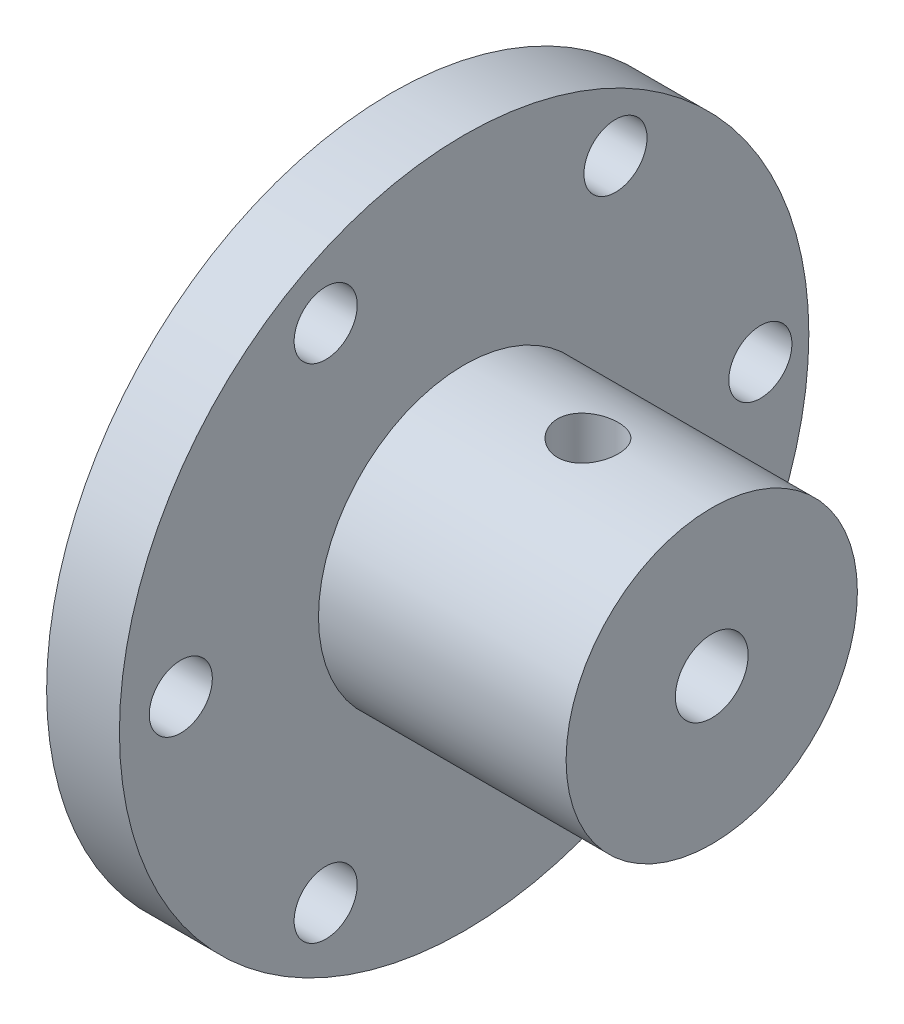
ISO-10303-21;
HEADER;
FILE_DESCRIPTION(('STEP AP214'),'2;1');
FILE_NAME('part.step','',(''),(''),'','','');
FILE_SCHEMA(('AUTOMOTIVE_DESIGN { 1 0 10303 214 1 1 1 1 }'));
ENDSEC;
DATA;
#1=APPLICATION_CONTEXT('core data for automotive mechanical design processes');
#2=APPLICATION_PROTOCOL_DEFINITION('international standard','automotive_design',2000,#1);
#3=PRODUCT_CONTEXT('',#1,'mechanical');
#4=PRODUCT('Part','Part','',(#3));
#5=PRODUCT_RELATED_PRODUCT_CATEGORY('part','',(#4));
#6=PRODUCT_DEFINITION_FORMATION('','',#4);
#7=PRODUCT_DEFINITION_CONTEXT('part definition',#1,'design');
#8=PRODUCT_DEFINITION('design','',#6,#7);
#9=PRODUCT_DEFINITION_SHAPE('','',#8);
#10=(LENGTH_UNIT() NAMED_UNIT(*) SI_UNIT(.MILLI.,.METRE.));
#11=(NAMED_UNIT(*) PLANE_ANGLE_UNIT() SI_UNIT($,.RADIAN.));
#12=(NAMED_UNIT(*) SI_UNIT($,.STERADIAN.) SOLID_ANGLE_UNIT());
#13=UNCERTAINTY_MEASURE_WITH_UNIT(LENGTH_MEASURE(1.E-05),#10,'distance_accuracy_value','');
#14=(GEOMETRIC_REPRESENTATION_CONTEXT(3) GLOBAL_UNCERTAINTY_ASSIGNED_CONTEXT((#13)) GLOBAL_UNIT_ASSIGNED_CONTEXT((#10,
#11,#12)) REPRESENTATION_CONTEXT('',''));
#15=CARTESIAN_POINT('',(0.,0.,0.));
#16=DIRECTION('',(0.,0.,1.));
#17=DIRECTION('',(1.,0.,0.));
#18=AXIS2_PLACEMENT_3D('',#15,#16,#17);
#19=CARTESIAN_POINT('',(54.367533200894,0.,0.));
#20=DIRECTION('',(1.,0.,0.));
#21=DIRECTION('',(0.,0.,-1.));
#22=AXIS2_PLACEMENT_3D('',#19,#20,#21);
#23=CYLINDRICAL_SURFACE('',#22,12.);
#24=CARTESIAN_POINT('',(-60.0610272845415,0.,0.));
#25=DIRECTION('',(1.,0.,0.));
#26=DIRECTION('',(0.,0.,-1.));
#27=AXIS2_PLACEMENT_3D('',#24,#25,#26);
#28=CIRCLE('',#27,12.);
#29=CARTESIAN_POINT('',(-60.0610272845415,0.,-12.));
#30=VERTEX_POINT('',#29);
#31=EDGE_CURVE('E156',#30,#30,#28,.T.);
#32=ORIENTED_EDGE('',*,*,#31,.T.);
#33=EDGE_LOOP('',(#32));
#34=FACE_BOUND('',#33,.T.);
#35=CARTESIAN_POINT('',(-39.6610272845415,0.,0.));
#36=DIRECTION('',(1.,0.,0.));
#37=DIRECTION('',(0.,0.,-1.));
#38=AXIS2_PLACEMENT_3D('',#35,#36,#37);
#39=CIRCLE('',#38,12.);
#40=CARTESIAN_POINT('',(-39.6610272845415,0.,-12.));
#41=VERTEX_POINT('',#40);
#42=EDGE_CURVE('E64',#41,#41,#39,.T.);
#43=ORIENTED_EDGE('',*,*,#42,.F.);
#44=EDGE_LOOP('',(#43));
#45=FACE_BOUND('',#44,.T.);
#46=CARTESIAN_POINT('',(-52.3610272845415,12.,0.));
#47=CARTESIAN_POINT('',(-52.361022329603,11.999997430533,-0.138818083403322));
#48=CARTESIAN_POINT('',(-52.349425953104,11.9975665755008,-0.277697579041751));
#49=CARTESIAN_POINT('',(-52.3033885854758,11.9881040198136,-0.551522632533987));
#50=CARTESIAN_POINT('',(-52.2689302384676,11.9810688237849,-0.686465120256626));
#51=CARTESIAN_POINT('',(-52.1782863746978,11.963182183924,-0.948418264582685));
#52=CARTESIAN_POINT('',(-52.1221224925437,11.9523345410529,-1.07543667341837));
#53=CARTESIAN_POINT('',(-51.9897280668291,11.9279985561971,-1.31824065721192));
#54=CARTESIAN_POINT('',(-51.9134984222298,11.9145103325195,-1.43402673506866));
#55=CARTESIAN_POINT('',(-51.7419546041602,11.886154000493,-1.65278064861768));
#56=CARTESIAN_POINT('',(-51.6464032820713,11.8712701169706,-1.75556048832537));
#57=CARTESIAN_POINT('',(-51.4394379661513,11.8419131538489,-1.94375555353879));
#58=CARTESIAN_POINT('',(-51.328022660797,11.8274401083336,-2.02916934192198));
#59=CARTESIAN_POINT('',(-51.0911233470092,11.8003888519061,-2.18102063354434));
#60=CARTESIAN_POINT('',(-50.965510515536,11.7878309034965,-2.24726109361302));
#61=CARTESIAN_POINT('',(-50.704632380996,11.7662568130004,-2.35762238696128));
#62=CARTESIAN_POINT('',(-50.5693681196564,11.7572402893513,-2.40174560335283));
#63=CARTESIAN_POINT('',(-50.2950568097102,11.7439300197224,-2.46600480267474));
#64=CARTESIAN_POINT('',(-50.156090565872,11.7395711371173,-2.48647195393598));
#65=CARTESIAN_POINT('',(-49.8766335988162,11.7358738143298,-2.5038671531123));
#66=CARTESIAN_POINT('',(-49.7361430468109,11.7365348160196,-2.50079781789374));
#67=CARTESIAN_POINT('',(-49.4600652285911,11.7427434863835,-2.47147438074395));
#68=CARTESIAN_POINT('',(-49.3244353252191,11.748210673598,-2.44560210465441));
#69=CARTESIAN_POINT('',(-49.0594842652516,11.7632887523188,-2.37201087059891));
#70=CARTESIAN_POINT('',(-48.9301634333288,11.7728998568263,-2.32429078962764));
#71=CARTESIAN_POINT('',(-48.6804128277095,11.795263829282,-2.20800006427857));
#72=CARTESIAN_POINT('',(-48.5600546914873,11.8080390757117,-2.13928005068474));
#73=CARTESIAN_POINT('',(-48.3324357960052,11.8352778002144,-1.98304539854964));
#74=CARTESIAN_POINT('',(-48.2251766668695,11.8497414879707,-1.89552842452518));
#75=CARTESIAN_POINT('',(-48.0245993623807,11.8790746185981,-1.70214984309357));
#76=CARTESIAN_POINT('',(-47.9315949467475,11.8939464639894,-1.59596286682416));
#77=CARTESIAN_POINT('',(-47.7646664000835,11.92216176286,-1.36933457722359));
#78=CARTESIAN_POINT('',(-47.6907425553447,11.9355051934047,-1.24889305005153));
#79=CARTESIAN_POINT('',(-47.5640071214696,11.9591974188563,-0.996811082470952));
#80=CARTESIAN_POINT('',(-47.5112336754072,11.9695407942051,-0.865150923852994));
#81=CARTESIAN_POINT('',(-47.4286438748705,11.9860267642256,-0.594569241944306));
#82=CARTESIAN_POINT('',(-47.3988244980787,11.992169911921,-0.455648677190176));
#83=CARTESIAN_POINT('',(-47.3634387804057,11.9994855043091,-0.17718373140167));
#84=CARTESIAN_POINT('',(-47.357443401553,12.0007458707516,-0.0376961110523566));
#85=CARTESIAN_POINT('',(-47.3687171844797,11.9983990450554,0.240287597515429));
#86=CARTESIAN_POINT('',(-47.3859849217447,11.994792150963,0.378783745924516));
#87=CARTESIAN_POINT('',(-47.4429385914805,11.9831712995837,0.649452734239628));
#88=CARTESIAN_POINT('',(-47.4824022553084,11.9752010573615,0.781674385788414));
#89=CARTESIAN_POINT('',(-47.5823830053843,11.9557445448479,1.03762289332266));
#90=CARTESIAN_POINT('',(-47.6429017662734,11.9442579948915,1.16134907267355));
#91=CARTESIAN_POINT('',(-47.7841880410166,11.9188248298143,1.39858861388699));
#92=CARTESIAN_POINT('',(-47.8652111436796,11.9048478762466,1.51194643893967));
#93=CARTESIAN_POINT('',(-48.044866410694,11.8760513659942,1.72361089177304));
#94=CARTESIAN_POINT('',(-48.1435006355794,11.8612317108502,1.82191575582657));
#95=CARTESIAN_POINT('',(-48.3575384385409,11.8321204906275,2.0023572973036));
#96=CARTESIAN_POINT('',(-48.473193348452,11.81784178615,2.08419829200409));
#97=CARTESIAN_POINT('',(-48.7168598529691,11.7917120203161,2.22729438158487));
#98=CARTESIAN_POINT('',(-48.8448709328197,11.779860857893,2.28855033355728));
#99=CARTESIAN_POINT('',(-49.108949677138,11.7600340141608,2.38834492887845));
#100=CARTESIAN_POINT('',(-49.2449693588732,11.7520374556937,2.42700619656063));
#101=CARTESIAN_POINT('',(-49.521760385526,11.7407836941939,2.48088077046815));
#102=CARTESIAN_POINT('',(-49.6625310477804,11.7375258132073,2.49609743088882));
#103=CARTESIAN_POINT('',(-49.9418540865408,11.7361581461701,2.50251852975223));
#104=CARTESIAN_POINT('',(-50.0803954249856,11.73794804643,2.49419085245451));
#105=CARTESIAN_POINT('',(-50.3540553023819,11.7462489450985,2.45479810628064));
#106=CARTESIAN_POINT('',(-50.4891738741737,11.7527598981925,2.42373325564532));
#107=CARTESIAN_POINT('',(-50.7518228283228,11.7697226489543,2.3399643553717));
#108=CARTESIAN_POINT('',(-50.8793737775153,11.7801631401586,2.28732235136843));
#109=CARTESIAN_POINT('',(-51.1239048365948,11.8038141147747,2.16194914599515));
#110=CARTESIAN_POINT('',(-51.2408839638077,11.8170248553092,2.0892160796606));
#111=CARTESIAN_POINT('',(-51.4632705387004,11.8450315910229,1.92414739068482));
#112=CARTESIAN_POINT('',(-51.5684255336715,11.8598522773681,1.83147578083645));
#113=CARTESIAN_POINT('',(-51.7618462709942,11.8892367916642,1.62984887623067));
#114=CARTESIAN_POINT('',(-51.8501081196445,11.9038005596976,1.52088983766594));
#115=CARTESIAN_POINT('',(-52.0082044309096,11.9312288909527,1.28826885501541));
#116=CARTESIAN_POINT('',(-52.0778146443141,11.9440719214649,1.1644518430427));
#117=CARTESIAN_POINT('',(-52.1951277414015,11.9663981698818,0.906639687996911));
#118=CARTESIAN_POINT('',(-52.2428497789052,11.975884323642,0.77265356381449));
#119=CARTESIAN_POINT('',(-52.3061078411183,11.9886499956288,0.532030585800212));
#120=CARTESIAN_POINT('',(-52.3266648109592,11.9928807132279,0.42673518745586));
#121=CARTESIAN_POINT('',(-52.3541261930961,11.9985566557951,0.214305348353075));
#122=CARTESIAN_POINT('',(-52.3610311098759,12.0000019836917,0.107170975697744));
#123=CARTESIAN_POINT('',(-52.3610272845415,12.,0.));
#124=B_SPLINE_CURVE_WITH_KNOTS('',3,(#46,#47,#48,#49,#50,#51,#52,#53,#54,#55,#56,#57,#58,#59,
#60,#61,#62,#63,#64,#65,#66,#67,#68,#69,#70,#71,#72,#73,#74,#75,#76,#77,#78,#79,#80,#81,#82,#83,
#84,#85,#86,#87,#88,#89,#90,#91,#92,#93,#94,#95,#96,#97,#98,#99,#100,#101,#102,#103,#104,#105,
#106,#107,#108,#109,#110,#111,#112,#113,#114,#115,#116,#117,#118,#119,#120,#121,#122,#123),
.UNSPECIFIED.,.T.,.F.,(4,2,2,2,2,2,2,2,2,2,2,2,2,2,2,2,2,2,2,2,2,2,2,2,2,2,2,2,2,2,2,2,2,2,2,2,
2,2,4),(0.,0.416062090206367,0.832440399812452,1.24840475765089,1.66435048314598,
2.08575052776245,2.50718543103572,2.93280898357097,3.35838666570981,3.7779315033971,
4.19742969534329,4.61003424258119,5.0226600006056,5.43829184833499,5.8539753673607,
6.27779052710933,6.70161204556438,7.12619448999327,7.55072102091544,7.96756678815352,
8.38438703104556,8.79710573265245,9.20985726781868,9.62803167991475,10.0462550512915,
10.4714252765867,10.8965777970262,11.3194010019005,11.7421637082837,12.1565844658208,
12.5710012456272,12.9842346278651,13.3975063816296,13.8183804966062,14.2393515023474,
14.6651772879651,15.0906297292995,15.4118517695456,15.7330619394678),.UNSPECIFIED.);
#125=CARTESIAN_POINT('',(-52.3610272845415,12.,0.));
#126=VERTEX_POINT('',#125);
#127=EDGE_CURVE('E69',#126,#126,#124,.T.);
#128=ORIENTED_EDGE('',*,*,#127,.T.);
#129=EDGE_LOOP('',(#128));
#130=FACE_BOUND('',#129,.T.);
#131=ADVANCED_FACE('F32',(#34,#45,#130),#23,.T.);
#132=CARTESIAN_POINT('',(-39.6610272845415,2.99999999999997,0.));
#133=DIRECTION('',(1.,0.,0.));
#134=DIRECTION('',(0.,0.,-1.));
#135=AXIS2_PLACEMENT_3D('',#132,#133,#134);
#136=PLANE('',#135);
#137=ORIENTED_EDGE('',*,*,#42,.T.);
#138=EDGE_LOOP('',(#137));
#139=FACE_BOUND('',#138,.T.);
#140=CARTESIAN_POINT('',(-39.6610272845415,0.,0.));
#141=DIRECTION('',(1.,0.,0.));
#142=DIRECTION('',(0.,0.,-1.));
#143=AXIS2_PLACEMENT_3D('',#140,#141,#142);
#144=CIRCLE('',#143,2.99999999999997);
#145=CARTESIAN_POINT('',(-39.6610272845415,0.,-2.99999999999997));
#146=VERTEX_POINT('',#145);
#147=EDGE_CURVE('E158',#146,#146,#144,.T.);
#148=ORIENTED_EDGE('',*,*,#147,.F.);
#149=EDGE_LOOP('',(#148));
#150=FACE_BOUND('',#149,.T.);
#151=ADVANCED_FACE('F34',(#139,#150),#136,.T.);
#152=CARTESIAN_POINT('',(-60.0610272845415,12.,0.));
#153=DIRECTION('',(1.,0.,0.));
#154=DIRECTION('',(0.,0.,-1.));
#155=AXIS2_PLACEMENT_3D('',#152,#153,#154);
#156=PLANE('',#155);
#157=CARTESIAN_POINT('',(-60.0610272845415,20.6763565153535,11.4069443007805));
#158=DIRECTION('',(1.,0.,0.));
#159=DIRECTION('',(0.,0.,-1.));
#160=AXIS2_PLACEMENT_3D('',#157,#158,#159);
#161=CIRCLE('',#160,2.59999999999999);
#162=CARTESIAN_POINT('',(-60.0610272845415,20.6763565153535,8.80694430078052));
#163=VERTEX_POINT('',#162);
#164=EDGE_CURVE('E102',#163,#163,#161,.T.);
#165=ORIENTED_EDGE('',*,*,#164,.F.);
#166=EDGE_LOOP('',(#165));
#167=FACE_BOUND('',#166,.T.);
#168=CARTESIAN_POINT('',(-60.0610272845415,20.6763565153535,-12.4680556992195));
#169=DIRECTION('',(1.,0.,0.));
#170=DIRECTION('',(0.,0.,-1.));
#171=AXIS2_PLACEMENT_3D('',#168,#169,#170);
#172=CIRCLE('',#171,2.59999999999999);
#173=CARTESIAN_POINT('',(-60.0610272845415,20.6763565153535,-15.0680556992195));
#174=VERTEX_POINT('',#173);
#175=EDGE_CURVE('E297',#174,#174,#172,.T.);
#176=ORIENTED_EDGE('',*,*,#175,.F.);
#177=EDGE_LOOP('',(#176));
#178=FACE_BOUND('',#177,.T.);
#179=CARTESIAN_POINT('',(-60.0610272845415,0.,-24.4055556992195));
#180=DIRECTION('',(1.,0.,0.));
#181=DIRECTION('',(0.,0.,-1.));
#182=AXIS2_PLACEMENT_3D('',#179,#180,#181);
#183=CIRCLE('',#182,2.6);
#184=CARTESIAN_POINT('',(-60.0610272845415,0.,-27.0055556992195));
#185=VERTEX_POINT('',#184);
#186=EDGE_CURVE('E299',#185,#185,#183,.T.);
#187=ORIENTED_EDGE('',*,*,#186,.F.);
#188=EDGE_LOOP('',(#187));
#189=FACE_BOUND('',#188,.T.);
#190=CARTESIAN_POINT('',(-60.0610272845415,-20.6763565153535,-12.4680556992195));
#191=DIRECTION('',(1.,0.,0.));
#192=DIRECTION('',(0.,0.,-1.));
#193=AXIS2_PLACEMENT_3D('',#190,#191,#192);
#194=CIRCLE('',#193,2.59999999999999);
#195=CARTESIAN_POINT('',(-60.0610272845415,-20.6763565153535,-15.0680556992195));
#196=VERTEX_POINT('',#195);
#197=EDGE_CURVE('E303',#196,#196,#194,.T.);
#198=ORIENTED_EDGE('',*,*,#197,.F.);
#199=EDGE_LOOP('',(#198));
#200=FACE_BOUND('',#199,.T.);
#201=CARTESIAN_POINT('',(-60.0610272845415,-20.6763565153535,11.4069443007805));
#202=DIRECTION('',(1.,0.,0.));
#203=DIRECTION('',(0.,0.,-1.));
#204=AXIS2_PLACEMENT_3D('',#201,#202,#203);
#205=CIRCLE('',#204,2.59999999999999);
#206=CARTESIAN_POINT('',(-60.0610272845415,-20.6763565153535,8.80694430078049));
#207=VERTEX_POINT('',#206);
#208=EDGE_CURVE('E101',#207,#207,#205,.T.);
#209=ORIENTED_EDGE('',*,*,#208,.F.);
#210=EDGE_LOOP('',(#209));
#211=FACE_BOUND('',#210,.T.);
#212=CARTESIAN_POINT('',(-60.0610272845415,0.,23.3444443007805));
#213=DIRECTION('',(1.,0.,0.));
#214=DIRECTION('',(0.,0.,-1.));
#215=AXIS2_PLACEMENT_3D('',#212,#213,#214);
#216=CIRCLE('',#215,2.59999999999999);
#217=CARTESIAN_POINT('',(-60.0610272845415,0.,20.7444443007805));
#218=VERTEX_POINT('',#217);
#219=EDGE_CURVE('E167',#218,#218,#216,.T.);
#220=ORIENTED_EDGE('',*,*,#219,.F.);
#221=EDGE_LOOP('',(#220));
#222=FACE_BOUND('',#221,.T.);
#223=CARTESIAN_POINT('',(-60.0610272845415,0.,0.));
#224=DIRECTION('',(1.,0.,0.));
#225=DIRECTION('',(0.,0.,-1.));
#226=AXIS2_PLACEMENT_3D('',#223,#224,#225);
#227=CIRCLE('',#226,28.4);
#228=CARTESIAN_POINT('',(-60.0610272845415,0.,-28.4));
#229=VERTEX_POINT('',#228);
#230=EDGE_CURVE('E153',#229,#229,#227,.T.);
#231=ORIENTED_EDGE('',*,*,#230,.T.);
#232=EDGE_LOOP('',(#231));
#233=FACE_BOUND('',#232,.T.);
#234=ORIENTED_EDGE('',*,*,#31,.F.);
#235=EDGE_LOOP('',(#234));
#236=FACE_BOUND('',#235,.T.);
#237=ADVANCED_FACE('F108',(#167,#178,#189,#200,#211,#222,#233,#236),#156,.T.);
#238=CARTESIAN_POINT('',(54.367533200894,0.,0.));
#239=DIRECTION('',(1.,0.,0.));
#240=DIRECTION('',(0.,0.,-1.));
#241=AXIS2_PLACEMENT_3D('',#238,#239,#240);
#242=CYLINDRICAL_SURFACE('',#241,28.4);
#243=CARTESIAN_POINT('',(-66.0610272845415,0.,0.));
#244=DIRECTION('',(1.,0.,0.));
#245=DIRECTION('',(0.,0.,-1.));
#246=AXIS2_PLACEMENT_3D('',#243,#244,#245);
#247=CIRCLE('',#246,28.4);
#248=CARTESIAN_POINT('',(-66.0610272845415,0.,-28.4));
#249=VERTEX_POINT('',#248);
#250=EDGE_CURVE('E152',#249,#249,#247,.T.);
#251=ORIENTED_EDGE('',*,*,#250,.T.);
#252=EDGE_LOOP('',(#251));
#253=FACE_BOUND('',#252,.T.);
#254=ORIENTED_EDGE('',*,*,#230,.F.);
#255=EDGE_LOOP('',(#254));
#256=FACE_BOUND('',#255,.T.);
#257=ADVANCED_FACE('F111',(#253,#256),#242,.T.);
#258=CARTESIAN_POINT('',(-66.0610272845415,28.4,0.));
#259=DIRECTION('',(-1.,0.,0.));
#260=DIRECTION('',(0.,0.,1.));
#261=AXIS2_PLACEMENT_3D('',#258,#259,#260);
#262=PLANE('',#261);
#263=CARTESIAN_POINT('',(-66.0610272845415,20.6763565153535,11.4069443007805));
#264=DIRECTION('',(-1.,0.,0.));
#265=DIRECTION('',(0.,0.,1.));
#266=AXIS2_PLACEMENT_3D('',#263,#264,#265);
#267=CIRCLE('',#266,2.59999999999999);
#268=CARTESIAN_POINT('',(-66.0610272845415,20.6763565153535,14.0069443007805));
#269=VERTEX_POINT('',#268);
#270=EDGE_CURVE('E125',#269,#269,#267,.T.);
#271=ORIENTED_EDGE('',*,*,#270,.F.);
#272=EDGE_LOOP('',(#271));
#273=FACE_BOUND('',#272,.T.);
#274=CARTESIAN_POINT('',(-66.0610272845415,20.6763565153535,-12.4680556992195));
#275=DIRECTION('',(-1.,0.,0.));
#276=DIRECTION('',(0.,0.,1.));
#277=AXIS2_PLACEMENT_3D('',#274,#275,#276);
#278=CIRCLE('',#277,2.59999999999999);
#279=CARTESIAN_POINT('',(-66.0610272845415,20.6763565153535,-9.8680556992195));
#280=VERTEX_POINT('',#279);
#281=EDGE_CURVE('E129',#280,#280,#278,.T.);
#282=ORIENTED_EDGE('',*,*,#281,.F.);
#283=EDGE_LOOP('',(#282));
#284=FACE_BOUND('',#283,.T.);
#285=CARTESIAN_POINT('',(-66.0610272845415,0.,-24.4055556992195));
#286=DIRECTION('',(-1.,0.,0.));
#287=DIRECTION('',(0.,0.,1.));
#288=AXIS2_PLACEMENT_3D('',#285,#286,#287);
#289=CIRCLE('',#288,2.6);
#290=CARTESIAN_POINT('',(-66.0610272845415,0.,-21.8055556992195));
#291=VERTEX_POINT('',#290);
#292=EDGE_CURVE('E133',#291,#291,#289,.T.);
#293=ORIENTED_EDGE('',*,*,#292,.F.);
#294=EDGE_LOOP('',(#293));
#295=FACE_BOUND('',#294,.T.);
#296=CARTESIAN_POINT('',(-66.0610272845415,-20.6763565153535,-12.4680556992195));
#297=DIRECTION('',(-1.,0.,0.));
#298=DIRECTION('',(0.,0.,1.));
#299=AXIS2_PLACEMENT_3D('',#296,#297,#298);
#300=CIRCLE('',#299,2.59999999999999);
#301=CARTESIAN_POINT('',(-66.0610272845415,-20.6763565153535,-9.86805569921951));
#302=VERTEX_POINT('',#301);
#303=EDGE_CURVE('E137',#302,#302,#300,.T.);
#304=ORIENTED_EDGE('',*,*,#303,.F.);
#305=EDGE_LOOP('',(#304));
#306=FACE_BOUND('',#305,.T.);
#307=CARTESIAN_POINT('',(-66.0610272845415,-20.6763565153535,11.4069443007805));
#308=DIRECTION('',(-1.,0.,0.));
#309=DIRECTION('',(0.,0.,1.));
#310=AXIS2_PLACEMENT_3D('',#307,#308,#309);
#311=CIRCLE('',#310,2.59999999999999);
#312=CARTESIAN_POINT('',(-66.0610272845415,-20.6763565153535,14.0069443007805));
#313=VERTEX_POINT('',#312);
#314=EDGE_CURVE('E141',#313,#313,#311,.T.);
#315=ORIENTED_EDGE('',*,*,#314,.F.);
#316=EDGE_LOOP('',(#315));
#317=FACE_BOUND('',#316,.T.);
#318=CARTESIAN_POINT('',(-66.0610272845415,0.,23.3444443007805));
#319=DIRECTION('',(-1.,0.,0.));
#320=DIRECTION('',(0.,0.,1.));
#321=AXIS2_PLACEMENT_3D('',#318,#319,#320);
#322=CIRCLE('',#321,2.59999999999999);
#323=CARTESIAN_POINT('',(-66.0610272845415,0.,25.9444443007805));
#324=VERTEX_POINT('',#323);
#325=EDGE_CURVE('E145',#324,#324,#322,.T.);
#326=ORIENTED_EDGE('',*,*,#325,.F.);
#327=EDGE_LOOP('',(#326));
#328=FACE_BOUND('',#327,.T.);
#329=CARTESIAN_POINT('',(-66.0610272845415,0.,0.));
#330=DIRECTION('',(1.,0.,0.));
#331=DIRECTION('',(0.,0.,-1.));
#332=AXIS2_PLACEMENT_3D('',#329,#330,#331);
#333=CIRCLE('',#332,2.99999999999997);
#334=CARTESIAN_POINT('',(-66.0610272845415,0.,-2.99999999999997));
#335=VERTEX_POINT('',#334);
#336=EDGE_CURVE('E149',#335,#335,#333,.T.);
#337=ORIENTED_EDGE('',*,*,#336,.T.);
#338=EDGE_LOOP('',(#337));
#339=FACE_BOUND('',#338,.T.);
#340=ORIENTED_EDGE('',*,*,#250,.F.);
#341=EDGE_LOOP('',(#340));
#342=FACE_BOUND('',#341,.T.);
#343=ADVANCED_FACE('F114',(#273,#284,#295,#306,#317,#328,#339,#342),#262,.T.);
#344=CARTESIAN_POINT('',(54.367533200894,0.,0.));
#345=DIRECTION('',(1.,0.,0.));
#346=DIRECTION('',(0.,0.,-1.));
#347=AXIS2_PLACEMENT_3D('',#344,#345,#346);
#348=CYLINDRICAL_SURFACE('',#347,2.99999999999997);
#349=DIRECTION('',(1.,0.,0.));
#350=VECTOR('',#349,1.);
#351=CARTESIAN_POINT('',(54.367533200894,2.00000000000002,-2.23606797749973));
#352=LINE('',#351,#350);
#353=CARTESIAN_POINT('',(-50.9790612732915,1.99999999999997,-2.23606797749973));
#354=VERTEX_POINT('',#353);
#355=CARTESIAN_POINT('',(-48.7429932957915,1.99999999999997,-2.23606797749973));
#356=VERTEX_POINT('',#355);
#357=EDGE_CURVE('E11',#354,#356,#352,.T.);
#358=ORIENTED_EDGE('',*,*,#357,.F.);
#359=CARTESIAN_POINT('',(-50.9790612732915,1.99999999999997,-2.23606797749973));
#360=CARTESIAN_POINT('',(-51.0486505552297,2.03897348035311,-2.20123612885051));
#361=CARTESIAN_POINT('',(-51.1160933852554,2.07910004857916,-2.16348815276408));
#362=CARTESIAN_POINT('',(-51.2467674181627,2.16045859526596,-2.08223233673711));
#363=CARTESIAN_POINT('',(-51.3099966841881,2.20169107003294,-2.03872187502524));
#364=CARTESIAN_POINT('',(-51.4327482146371,2.28435065471969,-1.94567645710562));
#365=CARTESIAN_POINT('',(-51.4922369508757,2.32577669999363,-1.89609628681527));
#366=CARTESIAN_POINT('',(-51.6067514565234,2.40747610970877,-1.7912222315882));
#367=CARTESIAN_POINT('',(-51.6617784213682,2.44774978101998,-1.73592988619505));
#368=CARTESIAN_POINT('',(-51.8007788975845,2.55133483080955,-1.58237658949667));
#369=CARTESIAN_POINT('',(-51.8807772168051,2.61292040272915,-1.47923798054956));
#370=CARTESIAN_POINT('',(-52.0253355148276,2.72621272781714,-1.25821663238235));
#371=CARTESIAN_POINT('',(-52.0899473710525,2.77795255510201,-1.140385538954));
#372=CARTESIAN_POINT('',(-52.1904693212029,2.85930093218959,-0.914356791417746));
#373=CARTESIAN_POINT('',(-52.2294740275771,2.89123055263376,-0.80838265783997));
#374=CARTESIAN_POINT('',(-52.2932085470863,2.94366698347434,-0.589462385689435));
#375=CARTESIAN_POINT('',(-52.3179423579087,2.96417699277518,-0.476518209448898));
#376=CARTESIAN_POINT('',(-52.3516132245611,2.99214454540153,-0.246139320357315));
#377=CARTESIAN_POINT('',(-52.3604785644298,2.99954283012582,-0.12868665909055));
#378=CARTESIAN_POINT('',(-52.3615260718807,3.00041555930571,0.106341037648518));
#379=CARTESIAN_POINT('',(-52.3537102987623,2.99389172246058,0.223916056224694));
#380=CARTESIAN_POINT('',(-52.3231962205371,2.96853705553428,0.446543405401718));
#381=CARTESIAN_POINT('',(-52.3016628370509,2.95066989209283,0.55187204934293));
#382=CARTESIAN_POINT('',(-52.2460858530615,2.90486797810454,0.756820524006463));
#383=CARTESIAN_POINT('',(-52.2120419501186,2.87693298416975,0.856440216648451));
#384=CARTESIAN_POINT('',(-52.1300069689789,2.81027583276511,1.05555205794835));
#385=CARTESIAN_POINT('',(-52.0811570484127,2.77089856339993,1.15446691038406));
#386=CARTESIAN_POINT('',(-51.9726474395837,2.68474598024036,1.34272004963288));
#387=CARTESIAN_POINT('',(-51.9129729828668,2.63796057037139,1.43204498407415));
#388=CARTESIAN_POINT('',(-51.7535903801466,2.51555400948721,1.64097158989834));
#389=CARTESIAN_POINT('',(-51.6483816717923,2.43683991602805,1.75463336457563));
#390=CARTESIAN_POINT('',(-51.4780044936469,2.31582473550678,1.90820202560345));
#391=CARTESIAN_POINT('',(-51.4190994773007,2.27498359330317,1.95658230109077));
#392=CARTESIAN_POINT('',(-51.2971538734626,2.1932628591344,2.04776204772324));
#393=CARTESIAN_POINT('',(-51.234116048966,2.15238331050891,2.09056519141547));
#394=CARTESIAN_POINT('',(-51.138263083689,2.09302439260255,2.14941173329445));
#395=CARTESIAN_POINT('',(-51.107048607279,2.07410532480774,2.16765940684618));
#396=CARTESIAN_POINT('',(-51.0437364748213,2.03670139554233,2.20284034825767));
#397=CARTESIAN_POINT('',(-51.0116406743997,2.01821575403157,2.21977612803631));
#398=CARTESIAN_POINT('',(-50.9790612732915,2.00000000000001,2.23606797749974));
#399=B_SPLINE_CURVE_WITH_KNOTS('',3,(#359,#360,#361,#362,#363,#364,#365,#366,#367,#368,#369,
#370,#371,#372,#373,#374,#375,#376,#377,#378,#379,#380,#381,#382,#383,#384,#385,#386,#387,#388,
#389,#390,#391,#392,#393,#394,#395,#396,#397,#398),.UNSPECIFIED.,.F.,.F.,(4,2,2,2,2,2,2,2,2,2,2,
2,2,2,2,2,2,2,2,4),(0.,0.260971229663844,0.52206160453904,0.785231042257519,1.04832973477045,
1.47956991783719,1.90933485430469,2.25993666357203,2.61044021146633,2.96252386321719,
3.31456405241752,3.64009669333578,3.96563720447363,4.31575193582943,4.66634798902439,
5.18454713748359,5.44379471598525,5.70287070750748,5.82526653991306,5.9474219068526),.UNSPECIFIED.);
#400=CARTESIAN_POINT('',(-50.9790612732915,1.99999999999997,2.23606797749973));
#401=VERTEX_POINT('',#400);
#402=EDGE_CURVE('E63',#354,#401,#399,.T.);
#403=ORIENTED_EDGE('',*,*,#402,.T.);
#404=DIRECTION('',(1.,0.,0.));
#405=VECTOR('',#404,1.);
#406=CARTESIAN_POINT('',(54.367533200894,2.00000000000002,2.23606797749973));
#407=LINE('',#406,#405);
#408=CARTESIAN_POINT('',(-48.7429932957915,1.99999999999997,2.23606797749973));
#409=VERTEX_POINT('',#408);
#410=EDGE_CURVE('E58',#409,#401,#407,.F.);
#411=ORIENTED_EDGE('',*,*,#410,.F.);
#412=CARTESIAN_POINT('',(-48.7429932957915,1.99999999999997,2.23606797749973));
#413=CARTESIAN_POINT('',(-48.6734040138532,2.03897348035311,2.20123612885051));
#414=CARTESIAN_POINT('',(-48.6059611838276,2.07910004857915,2.16348815276408));
#415=CARTESIAN_POINT('',(-48.4752871509202,2.16045859526596,2.08223233673711));
#416=CARTESIAN_POINT('',(-48.4120578848949,2.20169107003294,2.03872187502524));
#417=CARTESIAN_POINT('',(-48.2893063544459,2.28435065471969,1.94567645710562));
#418=CARTESIAN_POINT('',(-48.2298176182072,2.32577669999363,1.89609628681527));
#419=CARTESIAN_POINT('',(-48.1153031125596,2.40747610970876,1.7912222315882));
#420=CARTESIAN_POINT('',(-48.0602761477148,2.44774978101998,1.73592988619506));
#421=CARTESIAN_POINT('',(-47.9212756714985,2.55133483080955,1.58237658949666));
#422=CARTESIAN_POINT('',(-47.8412773522779,2.61292040272915,1.47923798054956));
#423=CARTESIAN_POINT('',(-47.6967190542553,2.72621272781714,1.25821663238234));
#424=CARTESIAN_POINT('',(-47.6321071980305,2.77795255510201,1.140385538954));
#425=CARTESIAN_POINT('',(-47.5315852478801,2.85930093218959,0.914356791417745));
#426=CARTESIAN_POINT('',(-47.4925805415059,2.89123055263376,0.80838265783997));
#427=CARTESIAN_POINT('',(-47.4288460219967,2.94366698347434,0.589462385689434));
#428=CARTESIAN_POINT('',(-47.4041122111743,2.96417699277518,0.476518209448897));
#429=CARTESIAN_POINT('',(-47.3704413445219,2.99214454540153,0.246139320357312));
#430=CARTESIAN_POINT('',(-47.3615760046532,2.99954283012582,0.128686659090547));
#431=CARTESIAN_POINT('',(-47.3605284972023,3.00041555930571,-0.106341037648521));
#432=CARTESIAN_POINT('',(-47.3683442703207,2.99389172246058,-0.223916056224697));
#433=CARTESIAN_POINT('',(-47.3988583485459,2.96853705553428,-0.446543405401721));
#434=CARTESIAN_POINT('',(-47.4203917320321,2.95066989209283,-0.551872049342934));
#435=CARTESIAN_POINT('',(-47.4759687160214,2.90486797810454,-0.756820524006466));
#436=CARTESIAN_POINT('',(-47.5100126189644,2.87693298416975,-0.856440216648453));
#437=CARTESIAN_POINT('',(-47.592047600104,2.81027583276511,-1.05555205794835));
#438=CARTESIAN_POINT('',(-47.6408975206702,2.77089856339993,-1.15446691038406));
#439=CARTESIAN_POINT('',(-47.7494071294993,2.68474598024035,-1.34272004963288));
#440=CARTESIAN_POINT('',(-47.8090815862162,2.63796057037139,-1.43204498407415));
#441=CARTESIAN_POINT('',(-47.9684641889364,2.51555400948721,-1.64097158989835));
#442=CARTESIAN_POINT('',(-48.0736728972907,2.43683991602805,-1.75463336457563));
#443=CARTESIAN_POINT('',(-48.2440500754361,2.31582473550678,-1.90820202560346));
#444=CARTESIAN_POINT('',(-48.3029550917823,2.27498359330316,-1.95658230109077));
#445=CARTESIAN_POINT('',(-48.4249006956204,2.19326285913439,-2.04776204772325));
#446=CARTESIAN_POINT('',(-48.487938520117,2.15238331050891,-2.09056519141547));
#447=CARTESIAN_POINT('',(-48.583791485394,2.09302439260254,-2.14941173329445));
#448=CARTESIAN_POINT('',(-48.615005961804,2.07410532480774,-2.16765940684618));
#449=CARTESIAN_POINT('',(-48.6783180942617,2.03670139554233,-2.20284034825767));
#450=CARTESIAN_POINT('',(-48.7104138946833,2.01821575403157,-2.21977612803631));
#451=CARTESIAN_POINT('',(-48.7429932957915,2.00000000000001,-2.23606797749974));
#452=B_SPLINE_CURVE_WITH_KNOTS('',3,(#412,#413,#414,#415,#416,#417,#418,#419,#420,#421,#422,
#423,#424,#425,#426,#427,#428,#429,#430,#431,#432,#433,#434,#435,#436,#437,#438,#439,#440,#441,
#442,#443,#444,#445,#446,#447,#448,#449,#450,#451),.UNSPECIFIED.,.F.,.F.,(4,2,2,2,2,2,2,2,2,2,2,
2,2,2,2,2,2,2,2,4),(0.,0.260971229663844,0.522061604539033,0.785231042257517,1.04832973477045,
1.47956991783719,1.9093348543047,2.25993666357203,2.61044021146633,2.9625238632172,
3.31456405241752,3.64009669333578,3.96563720447364,4.31575193582943,4.6663479890244,
5.1845471374836,5.44379471598525,5.70287070750749,5.82526653991305,5.9474219068526),.UNSPECIFIED.);
#453=EDGE_CURVE('E40',#409,#356,#452,.T.);
#454=ORIENTED_EDGE('',*,*,#453,.T.);
#455=EDGE_LOOP('',(#358,#403,#411,#454));
#456=FACE_BOUND('',#455,.T.);
#457=ORIENTED_EDGE('',*,*,#147,.T.);
#458=EDGE_LOOP('',(#457));
#459=FACE_BOUND('',#458,.T.);
#460=ORIENTED_EDGE('',*,*,#336,.F.);
#461=EDGE_LOOP('',(#460));
#462=FACE_BOUND('',#461,.T.);
#463=ADVANCED_FACE('F72',(#456,#459,#462),#348,.F.);
#464=CARTESIAN_POINT('',(-70.0610272845415,0.,23.3444443007805));
#465=DIRECTION('',(1.,0.,0.));
#466=DIRECTION('',(0.,0.,-1.));
#467=AXIS2_PLACEMENT_3D('',#464,#465,#466);
#468=CYLINDRICAL_SURFACE('',#467,2.59999999999999);
#469=ORIENTED_EDGE('',*,*,#325,.T.);
#470=EDGE_LOOP('',(#469));
#471=FACE_BOUND('',#470,.T.);
#472=ORIENTED_EDGE('',*,*,#219,.T.);
#473=EDGE_LOOP('',(#472));
#474=FACE_BOUND('',#473,.T.);
#475=ADVANCED_FACE('F121',(#471,#474),#468,.F.);
#476=CARTESIAN_POINT('',(-70.0610272845415,-20.6763565153535,11.4069443007805));
#477=DIRECTION('',(1.,0.,0.));
#478=DIRECTION('',(0.,0.,-1.));
#479=AXIS2_PLACEMENT_3D('',#476,#477,#478);
#480=CYLINDRICAL_SURFACE('',#479,2.59999999999999);
#481=ORIENTED_EDGE('',*,*,#314,.T.);
#482=EDGE_LOOP('',(#481));
#483=FACE_BOUND('',#482,.T.);
#484=ORIENTED_EDGE('',*,*,#208,.T.);
#485=EDGE_LOOP('',(#484));
#486=FACE_BOUND('',#485,.T.);
#487=ADVANCED_FACE('F222',(#483,#486),#480,.F.);
#488=CARTESIAN_POINT('',(-70.0610272845415,-20.6763565153535,-12.4680556992195));
#489=DIRECTION('',(1.,0.,0.));
#490=DIRECTION('',(0.,0.,-1.));
#491=AXIS2_PLACEMENT_3D('',#488,#489,#490);
#492=CYLINDRICAL_SURFACE('',#491,2.59999999999999);
#493=ORIENTED_EDGE('',*,*,#303,.T.);
#494=EDGE_LOOP('',(#493));
#495=FACE_BOUND('',#494,.T.);
#496=ORIENTED_EDGE('',*,*,#197,.T.);
#497=EDGE_LOOP('',(#496));
#498=FACE_BOUND('',#497,.T.);
#499=ADVANCED_FACE('F230',(#495,#498),#492,.F.);
#500=CARTESIAN_POINT('',(-70.0610272845415,0.,-24.4055556992195));
#501=DIRECTION('',(1.,0.,0.));
#502=DIRECTION('',(0.,0.,-1.));
#503=AXIS2_PLACEMENT_3D('',#500,#501,#502);
#504=CYLINDRICAL_SURFACE('',#503,2.6);
#505=ORIENTED_EDGE('',*,*,#292,.T.);
#506=EDGE_LOOP('',(#505));
#507=FACE_BOUND('',#506,.T.);
#508=ORIENTED_EDGE('',*,*,#186,.T.);
#509=EDGE_LOOP('',(#508));
#510=FACE_BOUND('',#509,.T.);
#511=ADVANCED_FACE('F239',(#507,#510),#504,.F.);
#512=CARTESIAN_POINT('',(-70.0610272845415,20.6763565153535,-12.4680556992195));
#513=DIRECTION('',(1.,0.,0.));
#514=DIRECTION('',(0.,0.,-1.));
#515=AXIS2_PLACEMENT_3D('',#512,#513,#514);
#516=CYLINDRICAL_SURFACE('',#515,2.59999999999999);
#517=ORIENTED_EDGE('',*,*,#281,.T.);
#518=EDGE_LOOP('',(#517));
#519=FACE_BOUND('',#518,.T.);
#520=ORIENTED_EDGE('',*,*,#175,.T.);
#521=EDGE_LOOP('',(#520));
#522=FACE_BOUND('',#521,.T.);
#523=ADVANCED_FACE('F248',(#519,#522),#516,.F.);
#524=CARTESIAN_POINT('',(-70.0610272845415,20.6763565153535,11.4069443007805));
#525=DIRECTION('',(1.,0.,0.));
#526=DIRECTION('',(0.,0.,-1.));
#527=AXIS2_PLACEMENT_3D('',#524,#525,#526);
#528=CYLINDRICAL_SURFACE('',#527,2.59999999999999);
#529=ORIENTED_EDGE('',*,*,#270,.T.);
#530=EDGE_LOOP('',(#529));
#531=FACE_BOUND('',#530,.T.);
#532=ORIENTED_EDGE('',*,*,#164,.T.);
#533=EDGE_LOOP('',(#532));
#534=FACE_BOUND('',#533,.T.);
#535=ADVANCED_FACE('F92',(#531,#534),#528,.F.);
#536=CARTESIAN_POINT('',(-49.8610272845415,1.99999999999997,0.));
#537=DIRECTION('',(0.,-1.,0.));
#538=DIRECTION('',(1.,0.,0.));
#539=AXIS2_PLACEMENT_3D('',#536,#537,#538);
#540=PLANE('',#539);
#541=ORIENTED_EDGE('',*,*,#357,.T.);
#542=CARTESIAN_POINT('',(-49.8610272845415,1.99999999999997,0.));
#543=DIRECTION('',(0.,-1.,0.));
#544=DIRECTION('',(1.,0.,0.));
#545=AXIS2_PLACEMENT_3D('',#542,#543,#544);
#546=CIRCLE('',#545,2.5);
#547=EDGE_CURVE('E70',#354,#356,#546,.T.);
#548=ORIENTED_EDGE('',*,*,#547,.F.);
#549=EDGE_LOOP('',(#541,#548));
#550=FACE_BOUND('',#549,.T.);
#551=ADVANCED_FACE('F91',(#550),#540,.F.);
#552=CARTESIAN_POINT('',(-49.8610272845415,1.99999999999997,0.));
#553=DIRECTION('',(0.,1.,0.));
#554=DIRECTION('',(-1.,0.,0.));
#555=AXIS2_PLACEMENT_3D('',#552,#553,#554);
#556=CYLINDRICAL_SURFACE('',#555,2.5);
#557=EDGE_CURVE('E46',#409,#401,#546,.T.);
#558=ORIENTED_EDGE('',*,*,#557,.T.);
#559=ORIENTED_EDGE('',*,*,#402,.F.);
#560=ORIENTED_EDGE('',*,*,#547,.T.);
#561=ORIENTED_EDGE('',*,*,#453,.F.);
#562=EDGE_LOOP('',(#558,#559,#560,#561));
#563=FACE_BOUND('',#562,.T.);
#564=ORIENTED_EDGE('',*,*,#127,.F.);
#565=EDGE_LOOP('',(#564));
#566=FACE_BOUND('',#565,.T.);
#567=ADVANCED_FACE('F67',(#563,#566),#556,.F.);
#568=ORIENTED_EDGE('',*,*,#410,.T.);
#569=ORIENTED_EDGE('',*,*,#557,.F.);
#570=EDGE_LOOP('',(#568,#569));
#571=FACE_BOUND('',#570,.T.);
#572=ADVANCED_FACE('F59',(#571),#540,.F.);
#573=CLOSED_SHELL('',(#131,#151,#237,#257,#343,#463,#475,#487,#499,#511,#523,#535,#551,#567,#572));
#574=MANIFOLD_SOLID_BREP('B2',#573);
#575=ADVANCED_BREP_SHAPE_REPRESENTATION('',(#18,#574),#14);
#576=SHAPE_DEFINITION_REPRESENTATION(#9,#575);
ENDSEC;
END-ISO-10303-21;
